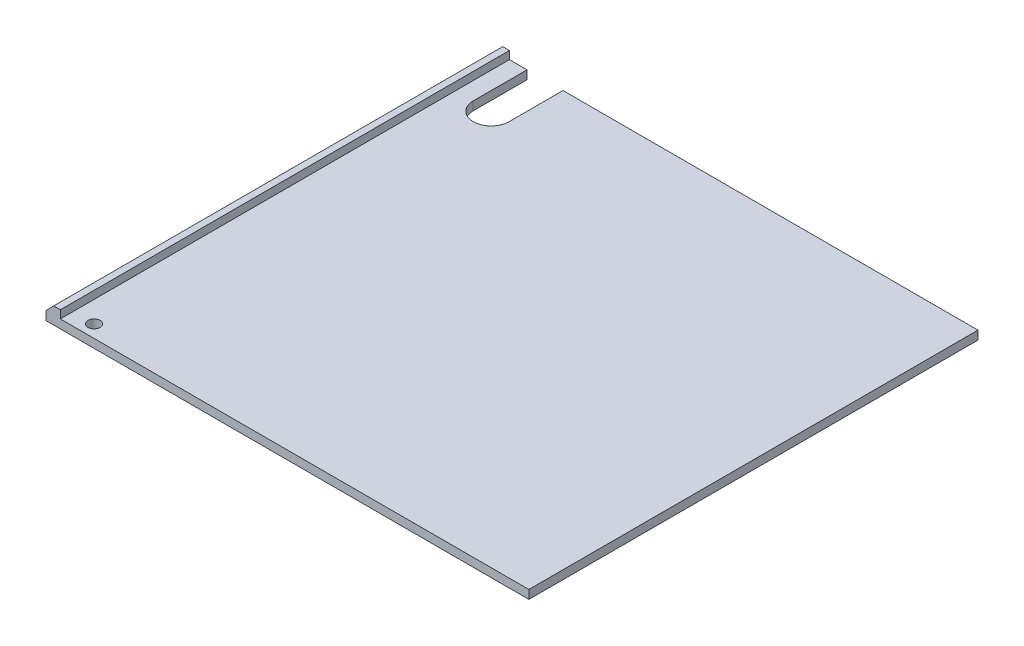
ISO-10303-21;
HEADER;
FILE_DESCRIPTION(('STEP AP214'),'2;1');
FILE_NAME('part.step','',(''),(''),'','','');
FILE_SCHEMA(('AUTOMOTIVE_DESIGN { 1 0 10303 214 1 1 1 1 }'));
ENDSEC;
DATA;
#1=APPLICATION_CONTEXT('core data for automotive mechanical design processes');
#2=APPLICATION_PROTOCOL_DEFINITION('international standard','automotive_design',2000,#1);
#3=PRODUCT_CONTEXT('',#1,'mechanical');
#4=PRODUCT('Part','Part','',(#3));
#5=PRODUCT_RELATED_PRODUCT_CATEGORY('part','',(#4));
#6=PRODUCT_DEFINITION_FORMATION('','',#4);
#7=PRODUCT_DEFINITION_CONTEXT('part definition',#1,'design');
#8=PRODUCT_DEFINITION('design','',#6,#7);
#9=PRODUCT_DEFINITION_SHAPE('','',#8);
#10=(LENGTH_UNIT() NAMED_UNIT(*) SI_UNIT(.MILLI.,.METRE.));
#11=(NAMED_UNIT(*) PLANE_ANGLE_UNIT() SI_UNIT($,.RADIAN.));
#12=(NAMED_UNIT(*) SI_UNIT($,.STERADIAN.) SOLID_ANGLE_UNIT());
#13=UNCERTAINTY_MEASURE_WITH_UNIT(LENGTH_MEASURE(1.E-05),#10,'distance_accuracy_value','');
#14=(GEOMETRIC_REPRESENTATION_CONTEXT(3) GLOBAL_UNCERTAINTY_ASSIGNED_CONTEXT((#13)) GLOBAL_UNIT_ASSIGNED_CONTEXT((#10,
#11,#12)) REPRESENTATION_CONTEXT('',''));
#15=CARTESIAN_POINT('',(0.,0.,0.));
#16=DIRECTION('',(0.,0.,1.));
#17=DIRECTION('',(1.,0.,0.));
#18=AXIS2_PLACEMENT_3D('',#15,#16,#17);
#19=CARTESIAN_POINT('',(-64.25,2.4,-62.5));
#20=DIRECTION('',(0.,0.,1.));
#21=DIRECTION('',(1.,0.,0.));
#22=AXIS2_PLACEMENT_3D('',#19,#20,#21);
#23=PLANE('',#22);
#24=DIRECTION('',(0.,1.,0.));
#25=VECTOR('',#24,1.);
#26=CARTESIAN_POINT('',(-51.25,0.,-62.5));
#27=LINE('',#26,#25);
#28=CARTESIAN_POINT('',(-51.25,0.,-62.5));
#29=VERTEX_POINT('',#28);
#30=CARTESIAN_POINT('',(-51.25,2.4,-62.5));
#31=VERTEX_POINT('',#30);
#32=EDGE_CURVE('E110',#29,#31,#27,.T.);
#33=ORIENTED_EDGE('',*,*,#32,.T.);
#34=DIRECTION('',(-1.,0.,0.));
#35=VECTOR('',#34,1.);
#36=CARTESIAN_POINT('',(-64.25,2.4,-62.5));
#37=LINE('',#36,#35);
#38=CARTESIAN_POINT('',(64.25,2.4,-62.5));
#39=VERTEX_POINT('',#38);
#40=EDGE_CURVE('E187',#39,#31,#37,.T.);
#41=ORIENTED_EDGE('',*,*,#40,.F.);
#42=DIRECTION('',(0.,-1.,0.));
#43=VECTOR('',#42,1.);
#44=CARTESIAN_POINT('',(64.25,2.4,-62.5));
#45=LINE('',#44,#43);
#46=CARTESIAN_POINT('',(64.25,0.,-62.5));
#47=VERTEX_POINT('',#46);
#48=EDGE_CURVE('E11',#39,#47,#45,.T.);
#49=ORIENTED_EDGE('',*,*,#48,.T.);
#50=DIRECTION('',(-1.,0.,0.));
#51=VECTOR('',#50,1.);
#52=CARTESIAN_POINT('',(-64.25,0.,-62.5));
#53=LINE('',#52,#51);
#54=EDGE_CURVE('E85',#47,#29,#53,.T.);
#55=ORIENTED_EDGE('',*,*,#54,.T.);
#56=EDGE_LOOP('',(#33,#41,#49,#55));
#57=FACE_BOUND('',#56,.T.);
#58=ADVANCED_FACE('F34',(#57),#23,.F.);
#59=CARTESIAN_POINT('',(64.25,2.4,-62.5));
#60=DIRECTION('',(-1.,0.,0.));
#61=DIRECTION('',(0.,0.,1.));
#62=AXIS2_PLACEMENT_3D('',#59,#60,#61);
#63=PLANE('',#62);
#64=DIRECTION('',(0.,0.,-1.));
#65=VECTOR('',#64,1.);
#66=CARTESIAN_POINT('',(64.25,0.,-62.5));
#67=LINE('',#66,#65);
#68=CARTESIAN_POINT('',(64.25,0.,62.5));
#69=VERTEX_POINT('',#68);
#70=EDGE_CURVE('E90',#69,#47,#67,.T.);
#71=ORIENTED_EDGE('',*,*,#70,.T.);
#72=ORIENTED_EDGE('',*,*,#48,.F.);
#73=DIRECTION('',(0.,0.,-1.));
#74=VECTOR('',#73,1.);
#75=CARTESIAN_POINT('',(64.25,2.4,-62.5));
#76=LINE('',#75,#74);
#77=CARTESIAN_POINT('',(64.25,2.4,62.5));
#78=VERTEX_POINT('',#77);
#79=EDGE_CURVE('E84',#78,#39,#76,.T.);
#80=ORIENTED_EDGE('',*,*,#79,.F.);
#81=DIRECTION('',(0.,-1.,0.));
#82=VECTOR('',#81,1.);
#83=CARTESIAN_POINT('',(64.25,2.4,62.5));
#84=LINE('',#83,#82);
#85=EDGE_CURVE('E42',#78,#69,#84,.T.);
#86=ORIENTED_EDGE('',*,*,#85,.T.);
#87=EDGE_LOOP('',(#71,#72,#80,#86));
#88=FACE_BOUND('',#87,.T.);
#89=ADVANCED_FACE('F36',(#88),#63,.F.);
#90=CARTESIAN_POINT('',(-61.25,2.4,-62.5));
#91=VERTEX_POINT('',#90);
#92=CARTESIAN_POINT('',(-66.15,2.4,-62.5));
#93=VERTEX_POINT('',#92);
#94=EDGE_CURVE('E186',#91,#93,#37,.T.);
#95=ORIENTED_EDGE('',*,*,#94,.F.);
#96=DIRECTION('',(0.,1.,0.));
#97=VECTOR('',#96,1.);
#98=CARTESIAN_POINT('',(-61.25,0.,-62.5));
#99=LINE('',#98,#97);
#100=CARTESIAN_POINT('',(-61.25,0.,-62.5));
#101=VERTEX_POINT('',#100);
#102=EDGE_CURVE('E195',#101,#91,#99,.T.);
#103=ORIENTED_EDGE('',*,*,#102,.F.);
#104=CARTESIAN_POINT('',(-70.1381499034572,0.,-62.5));
#105=VERTEX_POINT('',#104);
#106=EDGE_CURVE('E95',#101,#105,#53,.T.);
#107=ORIENTED_EDGE('',*,*,#106,.T.);
#108=DIRECTION('',(0.,1.,0.));
#109=VECTOR('',#108,1.);
#110=CARTESIAN_POINT('',(-70.1381499034572,2.45886936271697,-62.5));
#111=LINE('',#110,#109);
#112=CARTESIAN_POINT('',(-70.1381499034572,2.45886936271697,-62.5));
#113=VERTEX_POINT('',#112);
#114=EDGE_CURVE('E96',#105,#113,#111,.T.);
#115=ORIENTED_EDGE('',*,*,#114,.T.);
#116=DIRECTION('',(0.703585177960532,0.710610932475885,0.));
#117=VECTOR('',#116,1.);
#118=CARTESIAN_POINT('',(-68.0082873259483,4.61,-62.5));
#119=LINE('',#118,#117);
#120=CARTESIAN_POINT('',(-68.0082873259483,4.61,-62.5));
#121=VERTEX_POINT('',#120);
#122=EDGE_CURVE('E101',#113,#121,#119,.T.);
#123=ORIENTED_EDGE('',*,*,#122,.T.);
#124=DIRECTION('',(1.,0.,0.));
#125=VECTOR('',#124,1.);
#126=CARTESIAN_POINT('',(-66.15,4.61,-62.5));
#127=LINE('',#126,#125);
#128=CARTESIAN_POINT('',(-66.15,4.61,-62.5));
#129=VERTEX_POINT('',#128);
#130=EDGE_CURVE('E156',#121,#129,#127,.T.);
#131=ORIENTED_EDGE('',*,*,#130,.T.);
#132=DIRECTION('',(0.,-1.,0.));
#133=VECTOR('',#132,1.);
#134=CARTESIAN_POINT('',(-66.15,2.4,-62.5));
#135=LINE('',#134,#133);
#136=EDGE_CURVE('E160',#129,#93,#135,.T.);
#137=ORIENTED_EDGE('',*,*,#136,.T.);
#138=EDGE_LOOP('',(#95,#103,#107,#115,#123,#131,#137));
#139=FACE_BOUND('',#138,.T.);
#140=ADVANCED_FACE('F159',(#139),#23,.F.);
#141=CARTESIAN_POINT('',(-64.25,2.4,62.5));
#142=DIRECTION('',(0.,0.,-1.));
#143=DIRECTION('',(-1.,0.,0.));
#144=AXIS2_PLACEMENT_3D('',#141,#142,#143);
#145=PLANE('',#144);
#146=DIRECTION('',(1.,0.,0.));
#147=VECTOR('',#146,1.);
#148=CARTESIAN_POINT('',(-64.25,0.,62.5));
#149=LINE('',#148,#147);
#150=CARTESIAN_POINT('',(-70.1381499034572,0.,62.5));
#151=VERTEX_POINT('',#150);
#152=EDGE_CURVE('E72',#151,#69,#149,.T.);
#153=ORIENTED_EDGE('',*,*,#152,.T.);
#154=ORIENTED_EDGE('',*,*,#85,.F.);
#155=DIRECTION('',(1.,0.,0.));
#156=VECTOR('',#155,1.);
#157=CARTESIAN_POINT('',(-64.25,2.4,62.5));
#158=LINE('',#157,#156);
#159=CARTESIAN_POINT('',(-66.15,2.4,62.5));
#160=VERTEX_POINT('',#159);
#161=EDGE_CURVE('E58',#160,#78,#158,.T.);
#162=ORIENTED_EDGE('',*,*,#161,.F.);
#163=DIRECTION('',(0.,1.,0.));
#164=VECTOR('',#163,1.);
#165=CARTESIAN_POINT('',(-66.15,2.4,62.5));
#166=LINE('',#165,#164);
#167=CARTESIAN_POINT('',(-66.15,4.61,62.5));
#168=VERTEX_POINT('',#167);
#169=EDGE_CURVE('E198',#160,#168,#166,.T.);
#170=ORIENTED_EDGE('',*,*,#169,.T.);
#171=DIRECTION('',(-1.,0.,0.));
#172=VECTOR('',#171,1.);
#173=CARTESIAN_POINT('',(-66.15,4.61,62.5));
#174=LINE('',#173,#172);
#175=CARTESIAN_POINT('',(-68.0082873259483,4.61,62.5));
#176=VERTEX_POINT('',#175);
#177=EDGE_CURVE('E177',#168,#176,#174,.T.);
#178=ORIENTED_EDGE('',*,*,#177,.T.);
#179=DIRECTION('',(-0.703585177960532,-0.710610932475885,0.));
#180=VECTOR('',#179,1.);
#181=CARTESIAN_POINT('',(-68.0082873259483,4.61,62.5));
#182=LINE('',#181,#180);
#183=CARTESIAN_POINT('',(-70.1381499034572,2.45886936271697,62.5));
#184=VERTEX_POINT('',#183);
#185=EDGE_CURVE('E207',#176,#184,#182,.T.);
#186=ORIENTED_EDGE('',*,*,#185,.T.);
#187=DIRECTION('',(0.,-1.,0.));
#188=VECTOR('',#187,1.);
#189=CARTESIAN_POINT('',(-70.1381499034572,2.45886936271697,62.5));
#190=LINE('',#189,#188);
#191=EDGE_CURVE('E79',#184,#151,#190,.T.);
#192=ORIENTED_EDGE('',*,*,#191,.T.);
#193=EDGE_LOOP('',(#153,#154,#162,#170,#178,#186,#192));
#194=FACE_BOUND('',#193,.T.);
#195=ADVANCED_FACE('F74',(#194),#145,.F.);
#196=CARTESIAN_POINT('',(0.,2.4,0.));
#197=DIRECTION('',(0.,1.,0.));
#198=DIRECTION('',(0.,0.,1.));
#199=AXIS2_PLACEMENT_3D('',#196,#197,#198);
#200=PLANE('',#199);
#201=CARTESIAN_POINT('',(-60.25,2.4,59.));
#202=DIRECTION('',(0.,1.,0.));
#203=DIRECTION('',(0.,0.,1.));
#204=AXIS2_PLACEMENT_3D('',#201,#202,#203);
#205=CIRCLE('',#204,1.7);
#206=CARTESIAN_POINT('',(-60.25,2.4,60.7));
#207=VERTEX_POINT('',#206);
#208=EDGE_CURVE('E227',#207,#207,#205,.T.);
#209=ORIENTED_EDGE('',*,*,#208,.F.);
#210=EDGE_LOOP('',(#209));
#211=FACE_BOUND('',#210,.T.);
#212=DIRECTION('',(0.,0.,1.));
#213=VECTOR('',#212,1.);
#214=CARTESIAN_POINT('',(-61.25,2.4,0.));
#215=LINE('',#214,#213);
#216=CARTESIAN_POINT('',(-61.25,2.4,-47.5));
#217=VERTEX_POINT('',#216);
#218=EDGE_CURVE('E193',#91,#217,#215,.T.);
#219=ORIENTED_EDGE('',*,*,#218,.F.);
#220=ORIENTED_EDGE('',*,*,#94,.T.);
#221=DIRECTION('',(0.,0.,1.));
#222=VECTOR('',#221,1.);
#223=CARTESIAN_POINT('',(-66.15,2.4,-69.9781287288722));
#224=LINE('',#223,#222);
#225=EDGE_CURVE('E172',#93,#160,#224,.T.);
#226=ORIENTED_EDGE('',*,*,#225,.T.);
#227=ORIENTED_EDGE('',*,*,#161,.T.);
#228=ORIENTED_EDGE('',*,*,#79,.T.);
#229=ORIENTED_EDGE('',*,*,#40,.T.);
#230=DIRECTION('',(0.,0.,1.));
#231=VECTOR('',#230,1.);
#232=CARTESIAN_POINT('',(-51.25,2.4,0.));
#233=LINE('',#232,#231);
#234=CARTESIAN_POINT('',(-51.25,2.4,-47.5));
#235=VERTEX_POINT('',#234);
#236=EDGE_CURVE('E217',#31,#235,#233,.T.);
#237=ORIENTED_EDGE('',*,*,#236,.T.);
#238=CARTESIAN_POINT('',(-56.25,2.4,-47.5));
#239=DIRECTION('',(0.,1.,0.));
#240=DIRECTION('',(0.,0.,1.));
#241=AXIS2_PLACEMENT_3D('',#238,#239,#240);
#242=CIRCLE('',#241,5.);
#243=EDGE_CURVE('E219',#217,#235,#242,.T.);
#244=ORIENTED_EDGE('',*,*,#243,.F.);
#245=EDGE_LOOP('',(#219,#220,#226,#227,#228,#229,#237,#244));
#246=FACE_BOUND('',#245,.T.);
#247=ADVANCED_FACE('F190',(#211,#246),#200,.T.);
#248=CARTESIAN_POINT('',(0.,0.,0.));
#249=DIRECTION('',(0.,1.,0.));
#250=DIRECTION('',(0.,0.,1.));
#251=AXIS2_PLACEMENT_3D('',#248,#249,#250);
#252=PLANE('',#251);
#253=CARTESIAN_POINT('',(-60.25,0.,59.));
#254=DIRECTION('',(0.,1.,0.));
#255=DIRECTION('',(0.,0.,1.));
#256=AXIS2_PLACEMENT_3D('',#253,#254,#255);
#257=CIRCLE('',#256,1.7);
#258=CARTESIAN_POINT('',(-60.25,0.,60.7));
#259=VERTEX_POINT('',#258);
#260=EDGE_CURVE('E222',#259,#259,#257,.T.);
#261=ORIENTED_EDGE('',*,*,#260,.T.);
#262=EDGE_LOOP('',(#261));
#263=FACE_BOUND('',#262,.T.);
#264=ORIENTED_EDGE('',*,*,#106,.F.);
#265=DIRECTION('',(0.,0.,1.));
#266=VECTOR('',#265,1.);
#267=CARTESIAN_POINT('',(-61.25,0.,0.));
#268=LINE('',#267,#266);
#269=CARTESIAN_POINT('',(-61.25,0.,-47.5));
#270=VERTEX_POINT('',#269);
#271=EDGE_CURVE('E202',#101,#270,#268,.T.);
#272=ORIENTED_EDGE('',*,*,#271,.T.);
#273=CARTESIAN_POINT('',(-56.25,0.,-47.5));
#274=DIRECTION('',(0.,1.,0.));
#275=DIRECTION('',(0.,0.,1.));
#276=AXIS2_PLACEMENT_3D('',#273,#274,#275);
#277=CIRCLE('',#276,5.);
#278=CARTESIAN_POINT('',(-51.25,0.,-47.5));
#279=VERTEX_POINT('',#278);
#280=EDGE_CURVE('E224',#270,#279,#277,.T.);
#281=ORIENTED_EDGE('',*,*,#280,.T.);
#282=DIRECTION('',(0.,0.,1.));
#283=VECTOR('',#282,1.);
#284=CARTESIAN_POINT('',(-51.25,0.,0.));
#285=LINE('',#284,#283);
#286=EDGE_CURVE('E214',#29,#279,#285,.T.);
#287=ORIENTED_EDGE('',*,*,#286,.F.);
#288=ORIENTED_EDGE('',*,*,#54,.F.);
#289=ORIENTED_EDGE('',*,*,#70,.F.);
#290=ORIENTED_EDGE('',*,*,#152,.F.);
#291=DIRECTION('',(0.,0.,1.));
#292=VECTOR('',#291,1.);
#293=CARTESIAN_POINT('',(-70.1381499034572,0.,-69.9781287288722));
#294=LINE('',#293,#292);
#295=EDGE_CURVE('E173',#105,#151,#294,.T.);
#296=ORIENTED_EDGE('',*,*,#295,.F.);
#297=EDGE_LOOP('',(#264,#272,#281,#287,#288,#289,#290,#296));
#298=FACE_BOUND('',#297,.T.);
#299=ADVANCED_FACE('F92',(#263,#298),#252,.F.);
#300=CARTESIAN_POINT('',(-70.1381499034572,2.45886936271697,-69.9781287288722));
#301=DIRECTION('',(-1.,0.,0.));
#302=DIRECTION('',(0.,0.,1.));
#303=AXIS2_PLACEMENT_3D('',#300,#301,#302);
#304=PLANE('',#303);
#305=ORIENTED_EDGE('',*,*,#114,.F.);
#306=ORIENTED_EDGE('',*,*,#295,.T.);
#307=ORIENTED_EDGE('',*,*,#191,.F.);
#308=DIRECTION('',(0.,0.,1.));
#309=VECTOR('',#308,1.);
#310=CARTESIAN_POINT('',(-70.1381499034572,2.45886936271697,-69.9781287288722));
#311=LINE('',#310,#309);
#312=EDGE_CURVE('E181',#113,#184,#311,.T.);
#313=ORIENTED_EDGE('',*,*,#312,.F.);
#314=EDGE_LOOP('',(#305,#306,#307,#313));
#315=FACE_BOUND('',#314,.T.);
#316=ADVANCED_FACE('F247',(#315),#304,.T.);
#317=CARTESIAN_POINT('',(-68.0082873259483,4.61,-69.9781287288722));
#318=DIRECTION('',(-0.710610932475885,0.703585177960532,0.));
#319=DIRECTION('',(-0.703585177960532,-0.710610932475885,0.));
#320=AXIS2_PLACEMENT_3D('',#317,#318,#319);
#321=PLANE('',#320);
#322=ORIENTED_EDGE('',*,*,#122,.F.);
#323=ORIENTED_EDGE('',*,*,#312,.T.);
#324=ORIENTED_EDGE('',*,*,#185,.F.);
#325=DIRECTION('',(0.,0.,1.));
#326=VECTOR('',#325,1.);
#327=CARTESIAN_POINT('',(-68.0082873259483,4.61,-69.9781287288722));
#328=LINE('',#327,#326);
#329=EDGE_CURVE('E179',#121,#176,#328,.T.);
#330=ORIENTED_EDGE('',*,*,#329,.F.);
#331=EDGE_LOOP('',(#322,#323,#324,#330));
#332=FACE_BOUND('',#331,.T.);
#333=ADVANCED_FACE('F278',(#332),#321,.T.);
#334=CARTESIAN_POINT('',(-66.15,4.61,-69.9781287288722));
#335=DIRECTION('',(0.,1.,0.));
#336=DIRECTION('',(0.,0.,1.));
#337=AXIS2_PLACEMENT_3D('',#334,#335,#336);
#338=PLANE('',#337);
#339=ORIENTED_EDGE('',*,*,#130,.F.);
#340=ORIENTED_EDGE('',*,*,#329,.T.);
#341=ORIENTED_EDGE('',*,*,#177,.F.);
#342=DIRECTION('',(0.,0.,1.));
#343=VECTOR('',#342,1.);
#344=CARTESIAN_POINT('',(-66.15,4.61,-69.9781287288722));
#345=LINE('',#344,#343);
#346=EDGE_CURVE('E170',#129,#168,#345,.T.);
#347=ORIENTED_EDGE('',*,*,#346,.F.);
#348=EDGE_LOOP('',(#339,#340,#341,#347));
#349=FACE_BOUND('',#348,.T.);
#350=ADVANCED_FACE('F175',(#349),#338,.T.);
#351=CARTESIAN_POINT('',(-66.15,2.4,-69.9781287288722));
#352=DIRECTION('',(1.,0.,0.));
#353=DIRECTION('',(0.,0.,-1.));
#354=AXIS2_PLACEMENT_3D('',#351,#352,#353);
#355=PLANE('',#354);
#356=ORIENTED_EDGE('',*,*,#136,.F.);
#357=ORIENTED_EDGE('',*,*,#346,.T.);
#358=ORIENTED_EDGE('',*,*,#169,.F.);
#359=ORIENTED_EDGE('',*,*,#225,.F.);
#360=EDGE_LOOP('',(#356,#357,#358,#359));
#361=FACE_BOUND('',#360,.T.);
#362=ADVANCED_FACE('F168',(#361),#355,.T.);
#363=CARTESIAN_POINT('',(-61.25,0.,0.));
#364=DIRECTION('',(-1.,0.,0.));
#365=DIRECTION('',(0.,0.,1.));
#366=AXIS2_PLACEMENT_3D('',#363,#364,#365);
#367=PLANE('',#366);
#368=ORIENTED_EDGE('',*,*,#218,.T.);
#369=DIRECTION('',(0.,1.,0.));
#370=VECTOR('',#369,1.);
#371=CARTESIAN_POINT('',(-61.25,0.,-47.5));
#372=LINE('',#371,#370);
#373=EDGE_CURVE('E212',#270,#217,#372,.T.);
#374=ORIENTED_EDGE('',*,*,#373,.F.);
#375=ORIENTED_EDGE('',*,*,#271,.F.);
#376=ORIENTED_EDGE('',*,*,#102,.T.);
#377=EDGE_LOOP('',(#368,#374,#375,#376));
#378=FACE_BOUND('',#377,.T.);
#379=ADVANCED_FACE('F304',(#378),#367,.F.);
#380=CARTESIAN_POINT('',(-51.25,0.,0.));
#381=DIRECTION('',(-1.,0.,0.));
#382=DIRECTION('',(0.,0.,1.));
#383=AXIS2_PLACEMENT_3D('',#380,#381,#382);
#384=PLANE('',#383);
#385=ORIENTED_EDGE('',*,*,#236,.F.);
#386=ORIENTED_EDGE('',*,*,#32,.F.);
#387=ORIENTED_EDGE('',*,*,#286,.T.);
#388=DIRECTION('',(0.,1.,0.));
#389=VECTOR('',#388,1.);
#390=CARTESIAN_POINT('',(-51.25,0.,-47.5));
#391=LINE('',#390,#389);
#392=EDGE_CURVE('E49',#279,#235,#391,.T.);
#393=ORIENTED_EDGE('',*,*,#392,.T.);
#394=EDGE_LOOP('',(#385,#386,#387,#393));
#395=FACE_BOUND('',#394,.T.);
#396=ADVANCED_FACE('F320',(#395),#384,.T.);
#397=CARTESIAN_POINT('',(-56.25,0.,-47.5));
#398=DIRECTION('',(0.,1.,0.));
#399=DIRECTION('',(0.,0.,1.));
#400=AXIS2_PLACEMENT_3D('',#397,#398,#399);
#401=CYLINDRICAL_SURFACE('',#400,5.);
#402=ORIENTED_EDGE('',*,*,#243,.T.);
#403=ORIENTED_EDGE('',*,*,#392,.F.);
#404=ORIENTED_EDGE('',*,*,#280,.F.);
#405=ORIENTED_EDGE('',*,*,#373,.T.);
#406=EDGE_LOOP('',(#402,#403,#404,#405));
#407=FACE_BOUND('',#406,.T.);
#408=ADVANCED_FACE('F237',(#407),#401,.F.);
#409=CARTESIAN_POINT('',(-60.25,0.,59.));
#410=DIRECTION('',(0.,1.,0.));
#411=DIRECTION('',(0.,0.,1.));
#412=AXIS2_PLACEMENT_3D('',#409,#410,#411);
#413=CYLINDRICAL_SURFACE('',#412,1.7);
#414=ORIENTED_EDGE('',*,*,#260,.F.);
#415=EDGE_LOOP('',(#414));
#416=FACE_BOUND('',#415,.T.);
#417=ORIENTED_EDGE('',*,*,#208,.T.);
#418=EDGE_LOOP('',(#417));
#419=FACE_BOUND('',#418,.T.);
#420=ADVANCED_FACE('F234',(#416,#419),#413,.F.);
#421=CLOSED_SHELL('',(#58,#89,#140,#195,#247,#299,#316,#333,#350,#362,#379,#396,#408,#420));
#422=MANIFOLD_SOLID_BREP('B2',#421);
#423=ADVANCED_BREP_SHAPE_REPRESENTATION('',(#18,#422),#14);
#424=SHAPE_DEFINITION_REPRESENTATION(#9,#423);
ENDSEC;
END-ISO-10303-21;
